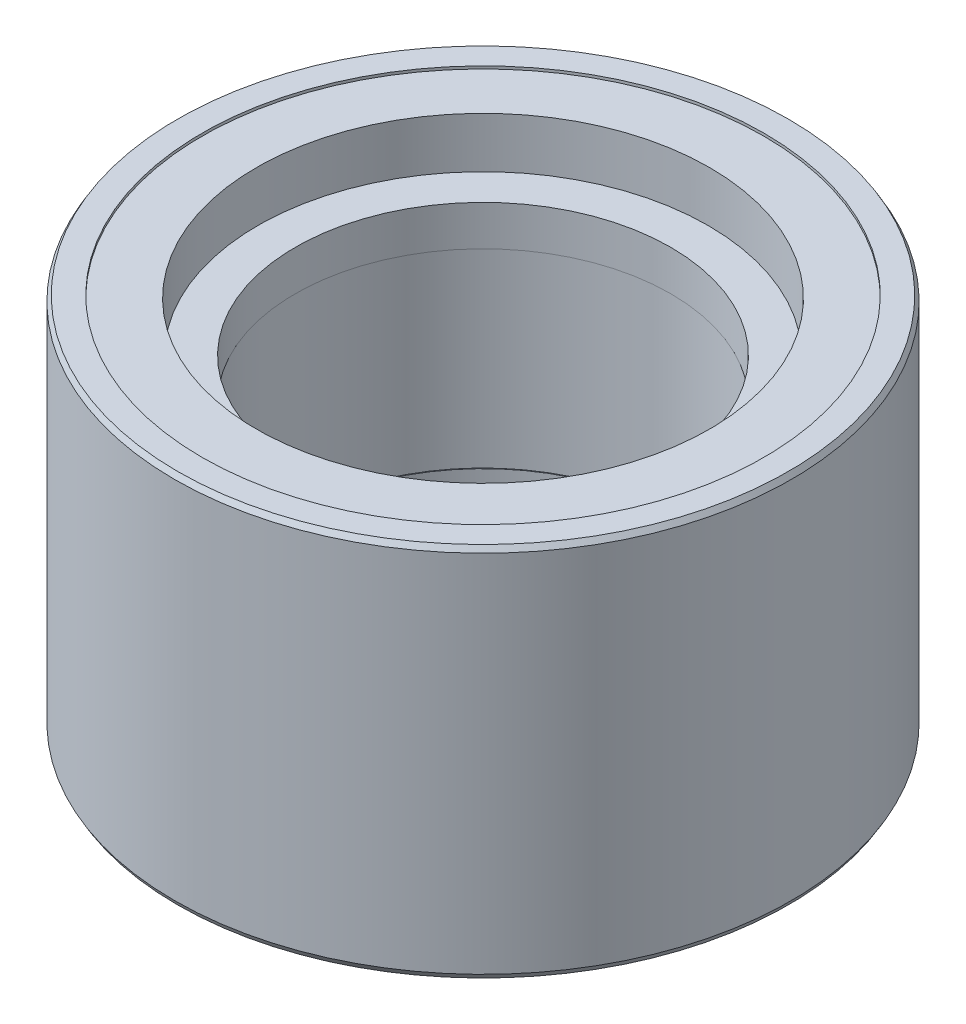
ISO-10303-21;
HEADER;
FILE_DESCRIPTION(('STEP AP214'),'2;1');
FILE_NAME('part.step','',(''),(''),'','','');
FILE_SCHEMA(('AUTOMOTIVE_DESIGN { 1 0 10303 214 1 1 1 1 }'));
ENDSEC;
DATA;
#1=APPLICATION_CONTEXT('core data for automotive mechanical design processes');
#2=APPLICATION_PROTOCOL_DEFINITION('international standard','automotive_design',2000,#1);
#3=PRODUCT_CONTEXT('',#1,'mechanical');
#4=PRODUCT('Part','Part','',(#3));
#5=PRODUCT_RELATED_PRODUCT_CATEGORY('part','',(#4));
#6=PRODUCT_DEFINITION_FORMATION('','',#4);
#7=PRODUCT_DEFINITION_CONTEXT('part definition',#1,'design');
#8=PRODUCT_DEFINITION('design','',#6,#7);
#9=PRODUCT_DEFINITION_SHAPE('','',#8);
#10=(LENGTH_UNIT() NAMED_UNIT(*) SI_UNIT(.MILLI.,.METRE.));
#11=(NAMED_UNIT(*) PLANE_ANGLE_UNIT() SI_UNIT($,.RADIAN.));
#12=(NAMED_UNIT(*) SI_UNIT($,.STERADIAN.) SOLID_ANGLE_UNIT());
#13=UNCERTAINTY_MEASURE_WITH_UNIT(LENGTH_MEASURE(1.E-05),#10,'distance_accuracy_value','');
#14=(GEOMETRIC_REPRESENTATION_CONTEXT(3) GLOBAL_UNCERTAINTY_ASSIGNED_CONTEXT((#13)) GLOBAL_UNIT_ASSIGNED_CONTEXT((#10,
#11,#12)) REPRESENTATION_CONTEXT('',''));
#15=CARTESIAN_POINT('',(0.,0.,0.));
#16=DIRECTION('',(0.,0.,1.));
#17=DIRECTION('',(1.,0.,0.));
#18=AXIS2_PLACEMENT_3D('',#15,#16,#17);
#19=CARTESIAN_POINT('',(0.,0.,0.));
#20=DIRECTION('',(0.,-1.,0.));
#21=DIRECTION('',(0.,0.,-1.));
#22=AXIS2_PLACEMENT_3D('',#19,#20,#21);
#23=PLANE('',#22);
#24=CARTESIAN_POINT('',(0.,0.,0.));
#25=DIRECTION('',(0.,-1.,0.));
#26=DIRECTION('',(0.,0.,-1.));
#27=AXIS2_PLACEMENT_3D('',#24,#25,#26);
#28=CIRCLE('',#27,113.845299461621);
#29=CARTESIAN_POINT('',(0.,0.,-113.845299461621));
#30=VERTEX_POINT('',#29);
#31=EDGE_CURVE('E11',#30,#30,#28,.T.);
#32=ORIENTED_EDGE('',*,*,#31,.T.);
#33=EDGE_LOOP('',(#32));
#34=FACE_BOUND('',#33,.T.);
#35=CARTESIAN_POINT('',(0.,0.,0.));
#36=DIRECTION('',(0.,-1.,0.));
#37=DIRECTION('',(0.,0.,-1.));
#38=AXIS2_PLACEMENT_3D('',#35,#36,#37);
#39=CIRCLE('',#38,104.75);
#40=CARTESIAN_POINT('',(0.,0.,-104.75));
#41=VERTEX_POINT('',#40);
#42=EDGE_CURVE('E81',#41,#41,#39,.T.);
#43=ORIENTED_EDGE('',*,*,#42,.F.);
#44=EDGE_LOOP('',(#43));
#45=FACE_BOUND('',#44,.T.);
#46=ADVANCED_FACE('F47',(#34,#45),#23,.T.);
#47=CARTESIAN_POINT('',(0.,0.,0.));
#48=DIRECTION('',(0.,1.,0.));
#49=DIRECTION('',(0.,0.,1.));
#50=AXIS2_PLACEMENT_3D('',#47,#48,#49);
#51=CONICAL_SURFACE('',#50,113.845299461621,0.523598775598295);
#52=CARTESIAN_POINT('',(0.,2.,0.));
#53=DIRECTION('',(0.,-1.,0.));
#54=DIRECTION('',(0.,0.,-1.));
#55=AXIS2_PLACEMENT_3D('',#52,#53,#54);
#56=CIRCLE('',#55,115.);
#57=CARTESIAN_POINT('',(0.,2.,-115.));
#58=VERTEX_POINT('',#57);
#59=EDGE_CURVE('E53',#58,#58,#56,.T.);
#60=ORIENTED_EDGE('',*,*,#59,.T.);
#61=EDGE_LOOP('',(#60));
#62=FACE_BOUND('',#61,.T.);
#63=ORIENTED_EDGE('',*,*,#31,.F.);
#64=EDGE_LOOP('',(#63));
#65=FACE_BOUND('',#64,.T.);
#66=ADVANCED_FACE('F89',(#62,#65),#51,.T.);
#67=CARTESIAN_POINT('',(0.,0.,0.));
#68=DIRECTION('',(0.,-1.,0.));
#69=DIRECTION('',(0.,0.,-1.));
#70=AXIS2_PLACEMENT_3D('',#67,#68,#69);
#71=CYLINDRICAL_SURFACE('',#70,115.);
#72=ORIENTED_EDGE('',*,*,#59,.F.);
#73=EDGE_LOOP('',(#72));
#74=FACE_BOUND('',#73,.T.);
#75=CARTESIAN_POINT('',(0.,138.,0.));
#76=DIRECTION('',(0.,-1.,0.));
#77=DIRECTION('',(0.,0.,-1.));
#78=AXIS2_PLACEMENT_3D('',#75,#76,#77);
#79=CIRCLE('',#78,115.);
#80=CARTESIAN_POINT('',(0.,138.,-115.));
#81=VERTEX_POINT('',#80);
#82=EDGE_CURVE('E57',#81,#81,#79,.T.);
#83=ORIENTED_EDGE('',*,*,#82,.T.);
#84=EDGE_LOOP('',(#83));
#85=FACE_BOUND('',#84,.T.);
#86=ADVANCED_FACE('F93',(#74,#85),#71,.T.);
#87=CARTESIAN_POINT('',(0.,140.,0.));
#88=DIRECTION('',(0.,-1.,0.));
#89=DIRECTION('',(0.,0.,-1.));
#90=AXIS2_PLACEMENT_3D('',#87,#88,#89);
#91=CONICAL_SURFACE('',#90,113.845299461621,0.523598775598294);
#92=ORIENTED_EDGE('',*,*,#82,.F.);
#93=EDGE_LOOP('',(#92));
#94=FACE_BOUND('',#93,.T.);
#95=CARTESIAN_POINT('',(0.,140.,0.));
#96=DIRECTION('',(0.,-1.,0.));
#97=DIRECTION('',(0.,0.,-1.));
#98=AXIS2_PLACEMENT_3D('',#95,#96,#97);
#99=CIRCLE('',#98,113.845299461621);
#100=CARTESIAN_POINT('',(0.,140.,-113.845299461621));
#101=VERTEX_POINT('',#100);
#102=EDGE_CURVE('E61',#101,#101,#99,.T.);
#103=ORIENTED_EDGE('',*,*,#102,.T.);
#104=EDGE_LOOP('',(#103));
#105=FACE_BOUND('',#104,.T.);
#106=ADVANCED_FACE('F97',(#94,#105),#91,.T.);
#107=CARTESIAN_POINT('',(0.,140.,0.));
#108=DIRECTION('',(0.,-1.,0.));
#109=DIRECTION('',(0.,0.,-1.));
#110=AXIS2_PLACEMENT_3D('',#107,#108,#109);
#111=PLANE('',#110);
#112=ORIENTED_EDGE('',*,*,#102,.F.);
#113=EDGE_LOOP('',(#112));
#114=FACE_BOUND('',#113,.T.);
#115=CARTESIAN_POINT('',(0.,140.,0.));
#116=DIRECTION('',(0.,-1.,0.));
#117=DIRECTION('',(0.,0.,-1.));
#118=AXIS2_PLACEMENT_3D('',#115,#116,#117);
#119=CIRCLE('',#118,104.75);
#120=CARTESIAN_POINT('',(0.,140.,-104.75));
#121=VERTEX_POINT('',#120);
#122=EDGE_CURVE('E66',#121,#121,#119,.T.);
#123=ORIENTED_EDGE('',*,*,#122,.T.);
#124=EDGE_LOOP('',(#123));
#125=FACE_BOUND('',#124,.T.);
#126=ADVANCED_FACE('F104',(#114,#125),#111,.F.);
#127=CARTESIAN_POINT('',(0.,0.,0.));
#128=DIRECTION('',(0.,-1.,0.));
#129=DIRECTION('',(0.,0.,-1.));
#130=AXIS2_PLACEMENT_3D('',#127,#128,#129);
#131=CYLINDRICAL_SURFACE('',#130,104.75);
#132=ORIENTED_EDGE('',*,*,#122,.F.);
#133=EDGE_LOOP('',(#132));
#134=FACE_BOUND('',#133,.T.);
#135=CARTESIAN_POINT('',(0.,139.,0.));
#136=DIRECTION('',(0.,-1.,0.));
#137=DIRECTION('',(0.,0.,-1.));
#138=AXIS2_PLACEMENT_3D('',#135,#136,#137);
#139=CIRCLE('',#138,104.75);
#140=CARTESIAN_POINT('',(0.,139.,-104.75));
#141=VERTEX_POINT('',#140);
#142=EDGE_CURVE('E69',#141,#141,#139,.T.);
#143=ORIENTED_EDGE('',*,*,#142,.T.);
#144=EDGE_LOOP('',(#143));
#145=FACE_BOUND('',#144,.T.);
#146=ADVANCED_FACE('F108',(#134,#145),#131,.F.);
#147=CARTESIAN_POINT('',(0.,139.,0.));
#148=DIRECTION('',(0.,-1.,0.));
#149=DIRECTION('',(0.,0.,-1.));
#150=AXIS2_PLACEMENT_3D('',#147,#148,#149);
#151=PLANE('',#150);
#152=ORIENTED_EDGE('',*,*,#142,.F.);
#153=EDGE_LOOP('',(#152));
#154=FACE_BOUND('',#153,.T.);
#155=CARTESIAN_POINT('',(0.,139.,0.));
#156=DIRECTION('',(0.,-1.,0.));
#157=DIRECTION('',(0.,0.,-1.));
#158=AXIS2_PLACEMENT_3D('',#155,#156,#157);
#159=CIRCLE('',#158,84.5);
#160=CARTESIAN_POINT('',(0.,139.,-84.5));
#161=VERTEX_POINT('',#160);
#162=EDGE_CURVE('E72',#161,#161,#159,.T.);
#163=ORIENTED_EDGE('',*,*,#162,.T.);
#164=EDGE_LOOP('',(#163));
#165=FACE_BOUND('',#164,.T.);
#166=ADVANCED_FACE('F112',(#154,#165),#151,.F.);
#167=CARTESIAN_POINT('',(0.,0.,0.));
#168=DIRECTION('',(0.,-1.,0.));
#169=DIRECTION('',(0.,0.,-1.));
#170=AXIS2_PLACEMENT_3D('',#167,#168,#169);
#171=CYLINDRICAL_SURFACE('',#170,84.5);
#172=ORIENTED_EDGE('',*,*,#162,.F.);
#173=EDGE_LOOP('',(#172));
#174=FACE_BOUND('',#173,.T.);
#175=CARTESIAN_POINT('',(0.,1.,0.));
#176=DIRECTION('',(0.,-1.,0.));
#177=DIRECTION('',(0.,0.,-1.));
#178=AXIS2_PLACEMENT_3D('',#175,#176,#177);
#179=CIRCLE('',#178,84.5);
#180=CARTESIAN_POINT('',(0.,1.,-84.5));
#181=VERTEX_POINT('',#180);
#182=EDGE_CURVE('E75',#181,#181,#179,.T.);
#183=ORIENTED_EDGE('',*,*,#182,.T.);
#184=EDGE_LOOP('',(#183));
#185=FACE_BOUND('',#184,.T.);
#186=ADVANCED_FACE('F116',(#174,#185),#171,.F.);
#187=CARTESIAN_POINT('',(0.,1.,0.));
#188=DIRECTION('',(0.,-1.,0.));
#189=DIRECTION('',(0.,0.,-1.));
#190=AXIS2_PLACEMENT_3D('',#187,#188,#189);
#191=PLANE('',#190);
#192=CARTESIAN_POINT('',(0.,1.,0.));
#193=DIRECTION('',(0.,-1.,0.));
#194=DIRECTION('',(0.,0.,-1.));
#195=AXIS2_PLACEMENT_3D('',#192,#193,#194);
#196=CIRCLE('',#195,104.75);
#197=CARTESIAN_POINT('',(0.,1.,-104.75));
#198=VERTEX_POINT('',#197);
#199=EDGE_CURVE('E78',#198,#198,#196,.T.);
#200=ORIENTED_EDGE('',*,*,#199,.T.);
#201=EDGE_LOOP('',(#200));
#202=FACE_BOUND('',#201,.T.);
#203=ORIENTED_EDGE('',*,*,#182,.F.);
#204=EDGE_LOOP('',(#203));
#205=FACE_BOUND('',#204,.T.);
#206=ADVANCED_FACE('F120',(#202,#205),#191,.T.);
#207=CARTESIAN_POINT('',(0.,0.,0.));
#208=DIRECTION('',(0.,-1.,0.));
#209=DIRECTION('',(0.,0.,-1.));
#210=AXIS2_PLACEMENT_3D('',#207,#208,#209);
#211=CYLINDRICAL_SURFACE('',#210,104.75);
#212=ORIENTED_EDGE('',*,*,#42,.T.);
#213=EDGE_LOOP('',(#212));
#214=FACE_BOUND('',#213,.T.);
#215=ORIENTED_EDGE('',*,*,#199,.F.);
#216=EDGE_LOOP('',(#215));
#217=FACE_BOUND('',#216,.T.);
#218=ADVANCED_FACE('F85',(#214,#217),#211,.F.);
#219=CLOSED_SHELL('',(#46,#66,#86,#106,#126,#146,#166,#186,#206,#218));
#220=MANIFOLD_SOLID_BREP('B2',#219);
#221=CARTESIAN_POINT('',(84.,120.5,0.));
#222=DIRECTION('',(0.,1.,0.));
#223=DIRECTION('',(0.,0.,1.));
#224=AXIS2_PLACEMENT_3D('',#221,#222,#223);
#225=PLANE('',#224);
#226=CARTESIAN_POINT('',(0.,120.5,0.));
#227=DIRECTION('',(0.,-1.,0.));
#228=DIRECTION('',(0.,0.,-1.));
#229=AXIS2_PLACEMENT_3D('',#226,#227,#228);
#230=CIRCLE('',#229,70.);
#231=CARTESIAN_POINT('',(0.,120.5,-70.));
#232=VERTEX_POINT('',#231);
#233=EDGE_CURVE('E46',#232,#232,#230,.T.);
#234=ORIENTED_EDGE('',*,*,#233,.T.);
#235=EDGE_LOOP('',(#234));
#236=FACE_BOUND('',#235,.T.);
#237=CARTESIAN_POINT('',(0.,120.5,0.));
#238=DIRECTION('',(0.,-1.,0.));
#239=DIRECTION('',(0.,0.,-1.));
#240=AXIS2_PLACEMENT_3D('',#237,#238,#239);
#241=CIRCLE('',#240,84.);
#242=CARTESIAN_POINT('',(0.,120.5,-84.));
#243=VERTEX_POINT('',#242);
#244=EDGE_CURVE('E229',#243,#243,#241,.T.);
#245=ORIENTED_EDGE('',*,*,#244,.F.);
#246=EDGE_LOOP('',(#245));
#247=FACE_BOUND('',#246,.T.);
#248=ADVANCED_FACE('F201',(#236,#247),#225,.T.);
#249=CARTESIAN_POINT('',(0.,120.5,0.));
#250=DIRECTION('',(0.,-1.,0.));
#251=DIRECTION('',(0.,0.,-1.));
#252=AXIS2_PLACEMENT_3D('',#249,#250,#251);
#253=CYLINDRICAL_SURFACE('',#252,70.);
#254=CARTESIAN_POINT('',(0.,105.5,0.));
#255=DIRECTION('',(0.,-1.,0.));
#256=DIRECTION('',(0.,0.,-1.));
#257=AXIS2_PLACEMENT_3D('',#254,#255,#256);
#258=CIRCLE('',#257,70.);
#259=CARTESIAN_POINT('',(0.,105.5,-70.));
#260=VERTEX_POINT('',#259);
#261=EDGE_CURVE('E207',#260,#260,#258,.T.);
#262=ORIENTED_EDGE('',*,*,#261,.T.);
#263=EDGE_LOOP('',(#262));
#264=FACE_BOUND('',#263,.T.);
#265=ORIENTED_EDGE('',*,*,#233,.F.);
#266=EDGE_LOOP('',(#265));
#267=FACE_BOUND('',#266,.T.);
#268=ADVANCED_FACE('F237',(#264,#267),#253,.F.);
#269=CARTESIAN_POINT('',(70.,105.5,0.));
#270=DIRECTION('',(0.,-1.,0.));
#271=DIRECTION('',(0.,0.,-1.));
#272=AXIS2_PLACEMENT_3D('',#269,#270,#271);
#273=PLANE('',#272);
#274=CARTESIAN_POINT('',(0.,105.5,0.));
#275=DIRECTION('',(0.,-1.,0.));
#276=DIRECTION('',(0.,0.,-1.));
#277=AXIS2_PLACEMENT_3D('',#274,#275,#276);
#278=CIRCLE('',#277,70.3);
#279=CARTESIAN_POINT('',(0.,105.5,-70.3));
#280=VERTEX_POINT('',#279);
#281=EDGE_CURVE('E211',#280,#280,#278,.T.);
#282=ORIENTED_EDGE('',*,*,#281,.T.);
#283=EDGE_LOOP('',(#282));
#284=FACE_BOUND('',#283,.T.);
#285=ORIENTED_EDGE('',*,*,#261,.F.);
#286=EDGE_LOOP('',(#285));
#287=FACE_BOUND('',#286,.T.);
#288=ADVANCED_FACE('F241',(#284,#287),#273,.T.);
#289=CARTESIAN_POINT('',(0.,120.5,0.));
#290=DIRECTION('',(0.,-1.,0.));
#291=DIRECTION('',(0.,0.,-1.));
#292=AXIS2_PLACEMENT_3D('',#289,#290,#291);
#293=CYLINDRICAL_SURFACE('',#292,70.3);
#294=CARTESIAN_POINT('',(0.,34.5,0.));
#295=DIRECTION('',(0.,-1.,0.));
#296=DIRECTION('',(0.,0.,-1.));
#297=AXIS2_PLACEMENT_3D('',#294,#295,#296);
#298=CIRCLE('',#297,70.3);
#299=CARTESIAN_POINT('',(0.,34.5,-70.3));
#300=VERTEX_POINT('',#299);
#301=EDGE_CURVE('E215',#300,#300,#298,.T.);
#302=ORIENTED_EDGE('',*,*,#301,.T.);
#303=EDGE_LOOP('',(#302));
#304=FACE_BOUND('',#303,.T.);
#305=ORIENTED_EDGE('',*,*,#281,.F.);
#306=EDGE_LOOP('',(#305));
#307=FACE_BOUND('',#306,.T.);
#308=ADVANCED_FACE('F245',(#304,#307),#293,.F.);
#309=CARTESIAN_POINT('',(70.3,34.5,0.));
#310=DIRECTION('',(0.,1.,0.));
#311=DIRECTION('',(0.,0.,1.));
#312=AXIS2_PLACEMENT_3D('',#309,#310,#311);
#313=PLANE('',#312);
#314=CARTESIAN_POINT('',(0.,34.5,0.));
#315=DIRECTION('',(0.,-1.,0.));
#316=DIRECTION('',(0.,0.,-1.));
#317=AXIS2_PLACEMENT_3D('',#314,#315,#316);
#318=CIRCLE('',#317,70.);
#319=CARTESIAN_POINT('',(0.,34.5,-70.));
#320=VERTEX_POINT('',#319);
#321=EDGE_CURVE('E220',#320,#320,#318,.T.);
#322=ORIENTED_EDGE('',*,*,#321,.T.);
#323=EDGE_LOOP('',(#322));
#324=FACE_BOUND('',#323,.T.);
#325=ORIENTED_EDGE('',*,*,#301,.F.);
#326=EDGE_LOOP('',(#325));
#327=FACE_BOUND('',#326,.T.);
#328=ADVANCED_FACE('F252',(#324,#327),#313,.T.);
#329=CARTESIAN_POINT('',(0.,120.5,0.));
#330=DIRECTION('',(0.,-1.,0.));
#331=DIRECTION('',(0.,0.,-1.));
#332=AXIS2_PLACEMENT_3D('',#329,#330,#331);
#333=CYLINDRICAL_SURFACE('',#332,70.);
#334=CARTESIAN_POINT('',(0.,19.5,0.));
#335=DIRECTION('',(0.,-1.,0.));
#336=DIRECTION('',(0.,0.,-1.));
#337=AXIS2_PLACEMENT_3D('',#334,#335,#336);
#338=CIRCLE('',#337,70.);
#339=CARTESIAN_POINT('',(0.,19.5,-70.));
#340=VERTEX_POINT('',#339);
#341=EDGE_CURVE('E223',#340,#340,#338,.T.);
#342=ORIENTED_EDGE('',*,*,#341,.T.);
#343=EDGE_LOOP('',(#342));
#344=FACE_BOUND('',#343,.T.);
#345=ORIENTED_EDGE('',*,*,#321,.F.);
#346=EDGE_LOOP('',(#345));
#347=FACE_BOUND('',#346,.T.);
#348=ADVANCED_FACE('F256',(#344,#347),#333,.F.);
#349=CARTESIAN_POINT('',(70.,19.5,0.));
#350=DIRECTION('',(0.,-1.,0.));
#351=DIRECTION('',(0.,0.,-1.));
#352=AXIS2_PLACEMENT_3D('',#349,#350,#351);
#353=PLANE('',#352);
#354=CARTESIAN_POINT('',(0.,19.5,0.));
#355=DIRECTION('',(0.,-1.,0.));
#356=DIRECTION('',(0.,0.,-1.));
#357=AXIS2_PLACEMENT_3D('',#354,#355,#356);
#358=CIRCLE('',#357,84.);
#359=CARTESIAN_POINT('',(0.,19.5,-84.));
#360=VERTEX_POINT('',#359);
#361=EDGE_CURVE('E226',#360,#360,#358,.T.);
#362=ORIENTED_EDGE('',*,*,#361,.T.);
#363=EDGE_LOOP('',(#362));
#364=FACE_BOUND('',#363,.T.);
#365=ORIENTED_EDGE('',*,*,#341,.F.);
#366=EDGE_LOOP('',(#365));
#367=FACE_BOUND('',#366,.T.);
#368=ADVANCED_FACE('F260',(#364,#367),#353,.T.);
#369=CARTESIAN_POINT('',(0.,120.5,0.));
#370=DIRECTION('',(0.,-1.,0.));
#371=DIRECTION('',(0.,0.,-1.));
#372=AXIS2_PLACEMENT_3D('',#369,#370,#371);
#373=CYLINDRICAL_SURFACE('',#372,84.);
#374=ORIENTED_EDGE('',*,*,#244,.T.);
#375=EDGE_LOOP('',(#374));
#376=FACE_BOUND('',#375,.T.);
#377=ORIENTED_EDGE('',*,*,#361,.F.);
#378=EDGE_LOOP('',(#377));
#379=FACE_BOUND('',#378,.T.);
#380=ADVANCED_FACE('F233',(#376,#379),#373,.T.);
#381=CLOSED_SHELL('',(#248,#268,#288,#308,#328,#348,#368,#380));
#382=MANIFOLD_SOLID_BREP('B6',#381);
#383=ADVANCED_BREP_SHAPE_REPRESENTATION('',(#18,#220,#382),#14);
#384=SHAPE_DEFINITION_REPRESENTATION(#9,#383);
ENDSEC;
END-ISO-10303-21;
